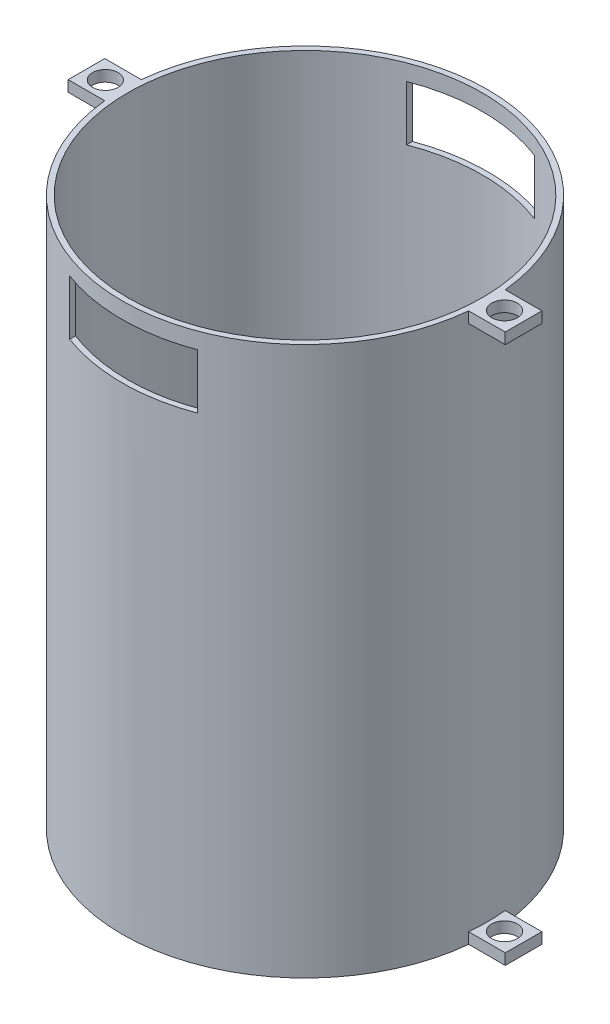
ISO-10303-21;
HEADER;
FILE_DESCRIPTION(('STEP AP214'),'2;1');
FILE_NAME('part.step','',(''),(''),'','','');
FILE_SCHEMA(('AUTOMOTIVE_DESIGN { 1 0 10303 214 1 1 1 1 }'));
ENDSEC;
DATA;
#1=APPLICATION_CONTEXT('core data for automotive mechanical design processes');
#2=APPLICATION_PROTOCOL_DEFINITION('international standard','automotive_design',2000,#1);
#3=PRODUCT_CONTEXT('',#1,'mechanical');
#4=PRODUCT('Part','Part','',(#3));
#5=PRODUCT_RELATED_PRODUCT_CATEGORY('part','',(#4));
#6=PRODUCT_DEFINITION_FORMATION('','',#4);
#7=PRODUCT_DEFINITION_CONTEXT('part definition',#1,'design');
#8=PRODUCT_DEFINITION('design','',#6,#7);
#9=PRODUCT_DEFINITION_SHAPE('','',#8);
#10=(LENGTH_UNIT() NAMED_UNIT(*) SI_UNIT(.MILLI.,.METRE.));
#11=(NAMED_UNIT(*) PLANE_ANGLE_UNIT() SI_UNIT($,.RADIAN.));
#12=(NAMED_UNIT(*) SI_UNIT($,.STERADIAN.) SOLID_ANGLE_UNIT());
#13=UNCERTAINTY_MEASURE_WITH_UNIT(LENGTH_MEASURE(1.E-05),#10,'distance_accuracy_value','');
#14=(GEOMETRIC_REPRESENTATION_CONTEXT(3) GLOBAL_UNCERTAINTY_ASSIGNED_CONTEXT((#13)) GLOBAL_UNIT_ASSIGNED_CONTEXT((#10,
#11,#12)) REPRESENTATION_CONTEXT('',''));
#15=CARTESIAN_POINT('',(0.,0.,0.));
#16=DIRECTION('',(0.,0.,1.));
#17=DIRECTION('',(1.,0.,0.));
#18=AXIS2_PLACEMENT_3D('',#15,#16,#17);
#19=CARTESIAN_POINT('',(0.,150.,0.));
#20=DIRECTION('',(0.,-1.,0.));
#21=DIRECTION('',(0.,0.,-1.));
#22=AXIS2_PLACEMENT_3D('',#19,#20,#21);
#23=CYLINDRICAL_SURFACE('',#22,50.);
#24=DIRECTION('',(0.,-1.,0.));
#25=VECTOR('',#24,1.);
#26=CARTESIAN_POINT('',(17.5,150.,46.837484987988));
#27=LINE('',#26,#25);
#28=CARTESIAN_POINT('',(17.5,130.572258372228,46.837484987988));
#29=VERTEX_POINT('',#28);
#30=CARTESIAN_POINT('',(17.5,145.572258372228,46.837484987988));
#31=VERTEX_POINT('',#30);
#32=EDGE_CURVE('E252',#29,#31,#27,.F.);
#33=ORIENTED_EDGE('',*,*,#32,.F.);
#34=CARTESIAN_POINT('',(0.,130.572258372228,0.));
#35=DIRECTION('',(0.,1.,0.));
#36=DIRECTION('',(0.,0.,1.));
#37=AXIS2_PLACEMENT_3D('',#34,#35,#36);
#38=CIRCLE('',#37,50.);
#39=CARTESIAN_POINT('',(-17.5,130.572258372228,46.837484987988));
#40=VERTEX_POINT('',#39);
#41=EDGE_CURVE('E237',#40,#29,#38,.T.);
#42=ORIENTED_EDGE('',*,*,#41,.F.);
#43=DIRECTION('',(0.,-1.,0.));
#44=VECTOR('',#43,1.);
#45=CARTESIAN_POINT('',(-17.5,150.,46.837484987988));
#46=LINE('',#45,#44);
#47=CARTESIAN_POINT('',(-17.5,145.572258372228,46.837484987988));
#48=VERTEX_POINT('',#47);
#49=EDGE_CURVE('E243',#48,#40,#46,.T.);
#50=ORIENTED_EDGE('',*,*,#49,.F.);
#51=CARTESIAN_POINT('',(0.,145.572258372228,0.));
#52=DIRECTION('',(0.,-1.,0.));
#53=DIRECTION('',(0.,0.,-1.));
#54=AXIS2_PLACEMENT_3D('',#51,#52,#53);
#55=CIRCLE('',#54,50.);
#56=EDGE_CURVE('E251',#31,#48,#55,.T.);
#57=ORIENTED_EDGE('',*,*,#56,.F.);
#58=EDGE_LOOP('',(#33,#42,#50,#57));
#59=FACE_BOUND('',#58,.T.);
#60=DIRECTION('',(0.,1.,0.));
#61=VECTOR('',#60,1.);
#62=CARTESIAN_POINT('',(-49.749371855331,147.,-5.));
#63=LINE('',#62,#61);
#64=CARTESIAN_POINT('',(-49.749371855331,147.,-5.));
#65=VERTEX_POINT('',#64);
#66=CARTESIAN_POINT('',(-49.749371855331,150.,-5.));
#67=VERTEX_POINT('',#66);
#68=EDGE_CURVE('E390',#65,#67,#63,.T.);
#69=ORIENTED_EDGE('',*,*,#68,.T.);
#70=CARTESIAN_POINT('',(0.,150.,0.));
#71=DIRECTION('',(0.,1.,0.));
#72=DIRECTION('',(0.,0.,1.));
#73=AXIS2_PLACEMENT_3D('',#70,#71,#72);
#74=CIRCLE('',#73,50.);
#75=CARTESIAN_POINT('',(49.749371855331,150.,-5.));
#76=VERTEX_POINT('',#75);
#77=EDGE_CURVE('E432',#76,#67,#74,.T.);
#78=ORIENTED_EDGE('',*,*,#77,.F.);
#79=DIRECTION('',(0.,1.,0.));
#80=VECTOR('',#79,1.);
#81=CARTESIAN_POINT('',(49.749371855331,147.,-5.));
#82=LINE('',#81,#80);
#83=CARTESIAN_POINT('',(49.749371855331,147.,-5.));
#84=VERTEX_POINT('',#83);
#85=EDGE_CURVE('E423',#84,#76,#82,.T.);
#86=ORIENTED_EDGE('',*,*,#85,.F.);
#87=CARTESIAN_POINT('',(0.,147.,0.));
#88=DIRECTION('',(0.,1.,0.));
#89=DIRECTION('',(0.,0.,1.));
#90=AXIS2_PLACEMENT_3D('',#87,#88,#89);
#91=CIRCLE('',#90,50.);
#92=CARTESIAN_POINT('',(49.749371855331,147.,5.));
#93=VERTEX_POINT('',#92);
#94=EDGE_CURVE('E436',#93,#84,#91,.T.);
#95=ORIENTED_EDGE('',*,*,#94,.F.);
#96=DIRECTION('',(0.,1.,0.));
#97=VECTOR('',#96,1.);
#98=CARTESIAN_POINT('',(49.749371855331,147.,5.));
#99=LINE('',#98,#97);
#100=CARTESIAN_POINT('',(49.749371855331,150.,5.));
#101=VERTEX_POINT('',#100);
#102=EDGE_CURVE('E427',#93,#101,#99,.T.);
#103=ORIENTED_EDGE('',*,*,#102,.T.);
#104=CARTESIAN_POINT('',(-49.749371855331,150.,5.00000000000003));
#105=VERTEX_POINT('',#104);
#106=EDGE_CURVE('E437',#105,#101,#74,.T.);
#107=ORIENTED_EDGE('',*,*,#106,.F.);
#108=DIRECTION('',(0.,1.,0.));
#109=VECTOR('',#108,1.);
#110=CARTESIAN_POINT('',(-49.749371855331,147.,5.));
#111=LINE('',#110,#109);
#112=CARTESIAN_POINT('',(-49.749371855331,147.,5.));
#113=VERTEX_POINT('',#112);
#114=EDGE_CURVE('E374',#113,#105,#111,.T.);
#115=ORIENTED_EDGE('',*,*,#114,.F.);
#116=CARTESIAN_POINT('',(0.,147.,0.));
#117=DIRECTION('',(0.,-1.,0.));
#118=DIRECTION('',(0.,0.,-1.));
#119=AXIS2_PLACEMENT_3D('',#116,#117,#118);
#120=CIRCLE('',#119,50.);
#121=EDGE_CURVE('E443',#113,#65,#120,.T.);
#122=ORIENTED_EDGE('',*,*,#121,.T.);
#123=EDGE_LOOP('',(#69,#78,#86,#95,#103,#107,#115,#122));
#124=FACE_BOUND('',#123,.T.);
#125=CARTESIAN_POINT('',(0.,3.,0.));
#126=DIRECTION('',(0.,1.,0.));
#127=DIRECTION('',(0.,0.,1.));
#128=AXIS2_PLACEMENT_3D('',#125,#126,#127);
#129=CIRCLE('',#128,50.);
#130=CARTESIAN_POINT('',(49.749371855331,3.,5.));
#131=VERTEX_POINT('',#130);
#132=CARTESIAN_POINT('',(49.749371855331,3.,-5.00000000000003));
#133=VERTEX_POINT('',#132);
#134=EDGE_CURVE('E46',#131,#133,#129,.T.);
#135=ORIENTED_EDGE('',*,*,#134,.T.);
#136=DIRECTION('',(0.,-1.,0.));
#137=VECTOR('',#136,1.);
#138=CARTESIAN_POINT('',(49.749371855331,3.,-5.));
#139=LINE('',#138,#137);
#140=CARTESIAN_POINT('',(49.749371855331,0.,-5.));
#141=VERTEX_POINT('',#140);
#142=EDGE_CURVE('E314',#133,#141,#139,.T.);
#143=ORIENTED_EDGE('',*,*,#142,.T.);
#144=CARTESIAN_POINT('',(0.,0.,0.));
#145=DIRECTION('',(0.,1.,0.));
#146=DIRECTION('',(0.,0.,1.));
#147=AXIS2_PLACEMENT_3D('',#144,#145,#146);
#148=CIRCLE('',#147,50.);
#149=CARTESIAN_POINT('',(-49.749371855331,0.,-5.00000000000003));
#150=VERTEX_POINT('',#149);
#151=EDGE_CURVE('E431',#141,#150,#148,.T.);
#152=ORIENTED_EDGE('',*,*,#151,.T.);
#153=DIRECTION('',(0.,-1.,0.));
#154=VECTOR('',#153,1.);
#155=CARTESIAN_POINT('',(-49.749371855331,3.,-5.));
#156=LINE('',#155,#154);
#157=CARTESIAN_POINT('',(-49.749371855331,3.,-5.00000000000003));
#158=VERTEX_POINT('',#157);
#159=EDGE_CURVE('E337',#158,#150,#156,.T.);
#160=ORIENTED_EDGE('',*,*,#159,.F.);
#161=CARTESIAN_POINT('',(0.,3.,0.));
#162=DIRECTION('',(0.,1.,0.));
#163=DIRECTION('',(0.,0.,1.));
#164=AXIS2_PLACEMENT_3D('',#161,#162,#163);
#165=CIRCLE('',#164,50.);
#166=CARTESIAN_POINT('',(-49.749371855331,3.,5.00000000000003));
#167=VERTEX_POINT('',#166);
#168=EDGE_CURVE('E447',#158,#167,#165,.T.);
#169=ORIENTED_EDGE('',*,*,#168,.T.);
#170=DIRECTION('',(0.,-1.,0.));
#171=VECTOR('',#170,1.);
#172=CARTESIAN_POINT('',(-49.749371855331,3.,5.));
#173=LINE('',#172,#171);
#174=CARTESIAN_POINT('',(-49.749371855331,0.,5.));
#175=VERTEX_POINT('',#174);
#176=EDGE_CURVE('E355',#167,#175,#173,.T.);
#177=ORIENTED_EDGE('',*,*,#176,.T.);
#178=CARTESIAN_POINT('',(49.749371855331,0.,5.));
#179=VERTEX_POINT('',#178);
#180=EDGE_CURVE('E438',#175,#179,#148,.T.);
#181=ORIENTED_EDGE('',*,*,#180,.T.);
#182=DIRECTION('',(0.,-1.,0.));
#183=VECTOR('',#182,1.);
#184=CARTESIAN_POINT('',(49.749371855331,3.,5.));
#185=LINE('',#184,#183);
#186=EDGE_CURVE('E318',#131,#179,#185,.T.);
#187=ORIENTED_EDGE('',*,*,#186,.F.);
#188=EDGE_LOOP('',(#135,#143,#152,#160,#169,#177,#181,#187));
#189=FACE_BOUND('',#188,.T.);
#190=DIRECTION('',(0.,-1.,0.));
#191=VECTOR('',#190,1.);
#192=CARTESIAN_POINT('',(17.5,150.,-46.837484987988));
#193=LINE('',#192,#191);
#194=CARTESIAN_POINT('',(17.5,145.572258372228,-46.837484987988));
#195=VERTEX_POINT('',#194);
#196=CARTESIAN_POINT('',(17.5,130.572258372228,-46.837484987988));
#197=VERTEX_POINT('',#196);
#198=EDGE_CURVE('E255',#195,#197,#193,.T.);
#199=ORIENTED_EDGE('',*,*,#198,.F.);
#200=CARTESIAN_POINT('',(-17.5,145.572258372228,-46.837484987988));
#201=VERTEX_POINT('',#200);
#202=EDGE_CURVE('E247',#201,#195,#55,.T.);
#203=ORIENTED_EDGE('',*,*,#202,.F.);
#204=DIRECTION('',(0.,-1.,0.));
#205=VECTOR('',#204,1.);
#206=CARTESIAN_POINT('',(-17.5,150.,-46.837484987988));
#207=LINE('',#206,#205);
#208=CARTESIAN_POINT('',(-17.5,130.572258372228,-46.837484987988));
#209=VERTEX_POINT('',#208);
#210=EDGE_CURVE('E240',#209,#201,#207,.F.);
#211=ORIENTED_EDGE('',*,*,#210,.F.);
#212=EDGE_CURVE('E216',#197,#209,#38,.T.);
#213=ORIENTED_EDGE('',*,*,#212,.F.);
#214=EDGE_LOOP('',(#199,#203,#211,#213));
#215=FACE_BOUND('',#214,.T.);
#216=ADVANCED_FACE('F38',(#59,#124,#189,#215),#23,.T.);
#217=CARTESIAN_POINT('',(0.,150.,0.));
#218=DIRECTION('',(0.,1.,0.));
#219=DIRECTION('',(0.,0.,1.));
#220=AXIS2_PLACEMENT_3D('',#217,#218,#219);
#221=PLANE('',#220);
#222=CARTESIAN_POINT('',(0.,150.,0.));
#223=DIRECTION('',(0.,1.,0.));
#224=DIRECTION('',(0.,0.,1.));
#225=AXIS2_PLACEMENT_3D('',#222,#223,#224);
#226=CIRCLE('',#225,48.5);
#227=CARTESIAN_POINT('',(0.,150.,48.5));
#228=VERTEX_POINT('',#227);
#229=EDGE_CURVE('E869',#228,#228,#226,.T.);
#230=ORIENTED_EDGE('',*,*,#229,.F.);
#231=EDGE_LOOP('',(#230));
#232=FACE_BOUND('',#231,.T.);
#233=CARTESIAN_POINT('',(-54.5860120609853,150.,0.));
#234=DIRECTION('',(0.,1.,0.));
#235=DIRECTION('',(0.,0.,1.));
#236=AXIS2_PLACEMENT_3D('',#233,#234,#235);
#237=CIRCLE('',#236,3.5);
#238=CARTESIAN_POINT('',(-54.5860120609853,150.,3.5));
#239=VERTEX_POINT('',#238);
#240=EDGE_CURVE('E268',#239,#239,#237,.T.);
#241=ORIENTED_EDGE('',*,*,#240,.F.);
#242=EDGE_LOOP('',(#241));
#243=FACE_BOUND('',#242,.T.);
#244=CARTESIAN_POINT('',(54.5451910506084,150.,0.));
#245=DIRECTION('',(0.,1.,0.));
#246=DIRECTION('',(0.,0.,1.));
#247=AXIS2_PLACEMENT_3D('',#244,#245,#246);
#248=CIRCLE('',#247,3.5);
#249=CARTESIAN_POINT('',(54.5451910506084,150.,3.5));
#250=VERTEX_POINT('',#249);
#251=EDGE_CURVE('E281',#250,#250,#248,.T.);
#252=ORIENTED_EDGE('',*,*,#251,.F.);
#253=EDGE_LOOP('',(#252));
#254=FACE_BOUND('',#253,.T.);
#255=ORIENTED_EDGE('',*,*,#77,.T.);
#256=DIRECTION('',(1.,0.,0.));
#257=VECTOR('',#256,1.);
#258=CARTESIAN_POINT('',(-59.749371855331,150.,-5.));
#259=LINE('',#258,#257);
#260=CARTESIAN_POINT('',(-59.749371855331,150.,-5.));
#261=VERTEX_POINT('',#260);
#262=EDGE_CURVE('E377',#261,#67,#259,.T.);
#263=ORIENTED_EDGE('',*,*,#262,.F.);
#264=DIRECTION('',(0.,0.,1.));
#265=VECTOR('',#264,1.);
#266=CARTESIAN_POINT('',(-59.749371855331,150.,-5.));
#267=LINE('',#266,#265);
#268=CARTESIAN_POINT('',(-59.749371855331,150.,5.));
#269=VERTEX_POINT('',#268);
#270=EDGE_CURVE('E367',#261,#269,#267,.T.);
#271=ORIENTED_EDGE('',*,*,#270,.T.);
#272=DIRECTION('',(1.,0.,0.));
#273=VECTOR('',#272,1.);
#274=CARTESIAN_POINT('',(-59.749371855331,150.,5.));
#275=LINE('',#274,#273);
#276=EDGE_CURVE('E351',#269,#105,#275,.T.);
#277=ORIENTED_EDGE('',*,*,#276,.T.);
#278=ORIENTED_EDGE('',*,*,#106,.T.);
#279=DIRECTION('',(-1.,0.,0.));
#280=VECTOR('',#279,1.);
#281=CARTESIAN_POINT('',(59.749371855331,150.,5.));
#282=LINE('',#281,#280);
#283=CARTESIAN_POINT('',(59.749371855331,150.,5.));
#284=VERTEX_POINT('',#283);
#285=EDGE_CURVE('E386',#284,#101,#282,.T.);
#286=ORIENTED_EDGE('',*,*,#285,.F.);
#287=DIRECTION('',(0.,0.,1.));
#288=VECTOR('',#287,1.);
#289=CARTESIAN_POINT('',(59.749371855331,150.,-5.));
#290=LINE('',#289,#288);
#291=CARTESIAN_POINT('',(59.749371855331,150.,-5.));
#292=VERTEX_POINT('',#291);
#293=EDGE_CURVE('E401',#292,#284,#290,.T.);
#294=ORIENTED_EDGE('',*,*,#293,.F.);
#295=DIRECTION('',(-1.,0.,0.));
#296=VECTOR('',#295,1.);
#297=CARTESIAN_POINT('',(59.749371855331,150.,-5.));
#298=LINE('',#297,#296);
#299=EDGE_CURVE('E412',#292,#76,#298,.T.);
#300=ORIENTED_EDGE('',*,*,#299,.T.);
#301=EDGE_LOOP('',(#255,#263,#271,#277,#278,#286,#294,#300));
#302=FACE_BOUND('',#301,.T.);
#303=ADVANCED_FACE('F509',(#232,#243,#254,#302),#221,.T.);
#304=CARTESIAN_POINT('',(0.,0.,0.));
#305=DIRECTION('',(0.,1.,0.));
#306=DIRECTION('',(0.,0.,1.));
#307=AXIS2_PLACEMENT_3D('',#304,#305,#306);
#308=PLANE('',#307);
#309=CARTESIAN_POINT('',(0.,0.,0.));
#310=DIRECTION('',(0.,1.,0.));
#311=DIRECTION('',(0.,0.,1.));
#312=AXIS2_PLACEMENT_3D('',#309,#310,#311);
#313=CIRCLE('',#312,48.5);
#314=CARTESIAN_POINT('',(0.,0.,48.5));
#315=VERTEX_POINT('',#314);
#316=EDGE_CURVE('E212',#315,#315,#313,.T.);
#317=ORIENTED_EDGE('',*,*,#316,.T.);
#318=EDGE_LOOP('',(#317));
#319=FACE_BOUND('',#318,.T.);
#320=CARTESIAN_POINT('',(-54.5860120609853,0.,0.));
#321=DIRECTION('',(0.,-1.,0.));
#322=DIRECTION('',(0.,0.,-1.));
#323=AXIS2_PLACEMENT_3D('',#320,#321,#322);
#324=CIRCLE('',#323,3.5);
#325=CARTESIAN_POINT('',(-54.5860120609853,0.,-3.5));
#326=VERTEX_POINT('',#325);
#327=EDGE_CURVE('E259',#326,#326,#324,.T.);
#328=ORIENTED_EDGE('',*,*,#327,.F.);
#329=EDGE_LOOP('',(#328));
#330=FACE_BOUND('',#329,.T.);
#331=CARTESIAN_POINT('',(54.5451910506084,0.,0.));
#332=DIRECTION('',(0.,-1.,0.));
#333=DIRECTION('',(0.,0.,-1.));
#334=AXIS2_PLACEMENT_3D('',#331,#332,#333);
#335=CIRCLE('',#334,3.5);
#336=CARTESIAN_POINT('',(54.5451910506084,0.,-3.5));
#337=VERTEX_POINT('',#336);
#338=EDGE_CURVE('E272',#337,#337,#335,.T.);
#339=ORIENTED_EDGE('',*,*,#338,.F.);
#340=EDGE_LOOP('',(#339));
#341=FACE_BOUND('',#340,.T.);
#342=ORIENTED_EDGE('',*,*,#151,.F.);
#343=DIRECTION('',(1.,0.,0.));
#344=VECTOR('',#343,1.);
#345=CARTESIAN_POINT('',(59.749371855331,0.,-5.));
#346=LINE('',#345,#344);
#347=CARTESIAN_POINT('',(59.749371855331,0.,-5.));
#348=VERTEX_POINT('',#347);
#349=EDGE_CURVE('E291',#141,#348,#346,.T.);
#350=ORIENTED_EDGE('',*,*,#349,.T.);
#351=DIRECTION('',(0.,0.,1.));
#352=VECTOR('',#351,1.);
#353=CARTESIAN_POINT('',(59.749371855331,0.,5.));
#354=LINE('',#353,#352);
#355=CARTESIAN_POINT('',(59.749371855331,0.,5.));
#356=VERTEX_POINT('',#355);
#357=EDGE_CURVE('E285',#348,#356,#354,.T.);
#358=ORIENTED_EDGE('',*,*,#357,.T.);
#359=DIRECTION('',(-1.,0.,0.));
#360=VECTOR('',#359,1.);
#361=CARTESIAN_POINT('',(59.749371855331,0.,5.));
#362=LINE('',#361,#360);
#363=EDGE_CURVE('E303',#356,#179,#362,.T.);
#364=ORIENTED_EDGE('',*,*,#363,.T.);
#365=ORIENTED_EDGE('',*,*,#180,.F.);
#366=DIRECTION('',(1.,0.,0.));
#367=VECTOR('',#366,1.);
#368=CARTESIAN_POINT('',(-59.749371855331,0.,5.));
#369=LINE('',#368,#367);
#370=CARTESIAN_POINT('',(-59.749371855331,0.,5.));
#371=VERTEX_POINT('',#370);
#372=EDGE_CURVE('E341',#371,#175,#369,.T.);
#373=ORIENTED_EDGE('',*,*,#372,.F.);
#374=DIRECTION('',(0.,0.,-1.));
#375=VECTOR('',#374,1.);
#376=CARTESIAN_POINT('',(-59.749371855331,0.,5.));
#377=LINE('',#376,#375);
#378=CARTESIAN_POINT('',(-59.749371855331,0.,-5.));
#379=VERTEX_POINT('',#378);
#380=EDGE_CURVE('E329',#371,#379,#377,.T.);
#381=ORIENTED_EDGE('',*,*,#380,.T.);
#382=DIRECTION('',(1.,0.,0.));
#383=VECTOR('',#382,1.);
#384=CARTESIAN_POINT('',(-59.749371855331,0.,-5.));
#385=LINE('',#384,#383);
#386=EDGE_CURVE('E313',#379,#150,#385,.T.);
#387=ORIENTED_EDGE('',*,*,#386,.T.);
#388=EDGE_LOOP('',(#342,#350,#358,#364,#365,#373,#381,#387));
#389=FACE_BOUND('',#388,.T.);
#390=ADVANCED_FACE('F488',(#319,#330,#341,#389),#308,.F.);
#391=CARTESIAN_POINT('',(59.749371855331,147.,5.));
#392=DIRECTION('',(0.,0.,-1.));
#393=DIRECTION('',(-1.,0.,0.));
#394=AXIS2_PLACEMENT_3D('',#391,#392,#393);
#395=PLANE('',#394);
#396=ORIENTED_EDGE('',*,*,#285,.T.);
#397=ORIENTED_EDGE('',*,*,#102,.F.);
#398=DIRECTION('',(-1.,0.,0.));
#399=VECTOR('',#398,1.);
#400=CARTESIAN_POINT('',(59.749371855331,147.,5.));
#401=LINE('',#400,#399);
#402=CARTESIAN_POINT('',(59.749371855331,147.,5.));
#403=VERTEX_POINT('',#402);
#404=EDGE_CURVE('E397',#403,#93,#401,.T.);
#405=ORIENTED_EDGE('',*,*,#404,.F.);
#406=DIRECTION('',(0.,1.,0.));
#407=VECTOR('',#406,1.);
#408=CARTESIAN_POINT('',(59.749371855331,147.,5.));
#409=LINE('',#408,#407);
#410=EDGE_CURVE('E408',#403,#284,#409,.T.);
#411=ORIENTED_EDGE('',*,*,#410,.T.);
#412=EDGE_LOOP('',(#396,#397,#405,#411));
#413=FACE_BOUND('',#412,.T.);
#414=ADVANCED_FACE('F545',(#413),#395,.F.);
#415=CARTESIAN_POINT('',(59.749371855331,147.,-5.));
#416=DIRECTION('',(0.,0.,-1.));
#417=DIRECTION('',(-1.,0.,0.));
#418=AXIS2_PLACEMENT_3D('',#415,#416,#417);
#419=PLANE('',#418);
#420=ORIENTED_EDGE('',*,*,#299,.F.);
#421=DIRECTION('',(0.,1.,0.));
#422=VECTOR('',#421,1.);
#423=CARTESIAN_POINT('',(59.749371855331,147.,-5.));
#424=LINE('',#423,#422);
#425=CARTESIAN_POINT('',(59.749371855331,147.,-5.));
#426=VERTEX_POINT('',#425);
#427=EDGE_CURVE('E420',#426,#292,#424,.T.);
#428=ORIENTED_EDGE('',*,*,#427,.F.);
#429=DIRECTION('',(-1.,0.,0.));
#430=VECTOR('',#429,1.);
#431=CARTESIAN_POINT('',(59.749371855331,147.,-5.));
#432=LINE('',#431,#430);
#433=EDGE_CURVE('E400',#426,#84,#432,.T.);
#434=ORIENTED_EDGE('',*,*,#433,.T.);
#435=ORIENTED_EDGE('',*,*,#85,.T.);
#436=EDGE_LOOP('',(#420,#428,#434,#435));
#437=FACE_BOUND('',#436,.T.);
#438=ADVANCED_FACE('F534',(#437),#419,.T.);
#439=CARTESIAN_POINT('',(59.749371855331,147.,-5.));
#440=DIRECTION('',(-1.,0.,0.));
#441=DIRECTION('',(0.,0.,1.));
#442=AXIS2_PLACEMENT_3D('',#439,#440,#441);
#443=PLANE('',#442);
#444=ORIENTED_EDGE('',*,*,#293,.T.);
#445=ORIENTED_EDGE('',*,*,#410,.F.);
#446=DIRECTION('',(0.,0.,1.));
#447=VECTOR('',#446,1.);
#448=CARTESIAN_POINT('',(59.749371855331,147.,-5.));
#449=LINE('',#448,#447);
#450=EDGE_CURVE('E405',#426,#403,#449,.T.);
#451=ORIENTED_EDGE('',*,*,#450,.F.);
#452=ORIENTED_EDGE('',*,*,#427,.T.);
#453=EDGE_LOOP('',(#444,#445,#451,#452));
#454=FACE_BOUND('',#453,.T.);
#455=ADVANCED_FACE('F572',(#454),#443,.F.);
#456=CARTESIAN_POINT('',(0.,147.,0.));
#457=DIRECTION('',(0.,1.,0.));
#458=DIRECTION('',(0.,0.,1.));
#459=AXIS2_PLACEMENT_3D('',#456,#457,#458);
#460=PLANE('',#459);
#461=CARTESIAN_POINT('',(54.5451910506084,147.,0.));
#462=DIRECTION('',(0.,1.,0.));
#463=DIRECTION('',(0.,0.,1.));
#464=AXIS2_PLACEMENT_3D('',#461,#462,#463);
#465=CIRCLE('',#464,3.5);
#466=CARTESIAN_POINT('',(54.5451910506084,147.,3.5));
#467=VERTEX_POINT('',#466);
#468=EDGE_CURVE('E277',#467,#467,#465,.T.);
#469=ORIENTED_EDGE('',*,*,#468,.T.);
#470=EDGE_LOOP('',(#469));
#471=FACE_BOUND('',#470,.T.);
#472=ORIENTED_EDGE('',*,*,#404,.T.);
#473=ORIENTED_EDGE('',*,*,#94,.T.);
#474=ORIENTED_EDGE('',*,*,#433,.F.);
#475=ORIENTED_EDGE('',*,*,#450,.T.);
#476=EDGE_LOOP('',(#472,#473,#474,#475));
#477=FACE_BOUND('',#476,.T.);
#478=ADVANCED_FACE('F540',(#471,#477),#460,.F.);
#479=CARTESIAN_POINT('',(-59.749371855331,147.,5.));
#480=DIRECTION('',(0.,0.,1.));
#481=DIRECTION('',(1.,0.,0.));
#482=AXIS2_PLACEMENT_3D('',#479,#480,#481);
#483=PLANE('',#482);
#484=ORIENTED_EDGE('',*,*,#276,.F.);
#485=DIRECTION('',(0.,1.,0.));
#486=VECTOR('',#485,1.);
#487=CARTESIAN_POINT('',(-59.749371855331,147.,5.));
#488=LINE('',#487,#486);
#489=CARTESIAN_POINT('',(-59.749371855331,147.,5.));
#490=VERTEX_POINT('',#489);
#491=EDGE_CURVE('E383',#490,#269,#488,.T.);
#492=ORIENTED_EDGE('',*,*,#491,.F.);
#493=DIRECTION('',(1.,0.,0.));
#494=VECTOR('',#493,1.);
#495=CARTESIAN_POINT('',(-59.749371855331,147.,5.));
#496=LINE('',#495,#494);
#497=EDGE_CURVE('E362',#490,#113,#496,.T.);
#498=ORIENTED_EDGE('',*,*,#497,.T.);
#499=ORIENTED_EDGE('',*,*,#114,.T.);
#500=EDGE_LOOP('',(#484,#492,#498,#499));
#501=FACE_BOUND('',#500,.T.);
#502=ADVANCED_FACE('F550',(#501),#483,.T.);
#503=CARTESIAN_POINT('',(-59.749371855331,147.,-5.));
#504=DIRECTION('',(-1.,0.,0.));
#505=DIRECTION('',(0.,0.,1.));
#506=AXIS2_PLACEMENT_3D('',#503,#504,#505);
#507=PLANE('',#506);
#508=ORIENTED_EDGE('',*,*,#270,.F.);
#509=DIRECTION('',(0.,1.,0.));
#510=VECTOR('',#509,1.);
#511=CARTESIAN_POINT('',(-59.749371855331,147.,-5.));
#512=LINE('',#511,#510);
#513=CARTESIAN_POINT('',(-59.749371855331,147.,-5.));
#514=VERTEX_POINT('',#513);
#515=EDGE_CURVE('E387',#514,#261,#512,.T.);
#516=ORIENTED_EDGE('',*,*,#515,.F.);
#517=DIRECTION('',(0.,0.,1.));
#518=VECTOR('',#517,1.);
#519=CARTESIAN_POINT('',(-59.749371855331,147.,-5.));
#520=LINE('',#519,#518);
#521=EDGE_CURVE('E370',#514,#490,#520,.T.);
#522=ORIENTED_EDGE('',*,*,#521,.T.);
#523=ORIENTED_EDGE('',*,*,#491,.T.);
#524=EDGE_LOOP('',(#508,#516,#522,#523));
#525=FACE_BOUND('',#524,.T.);
#526=ADVANCED_FACE('F556',(#525),#507,.T.);
#527=CARTESIAN_POINT('',(-59.749371855331,147.,-5.));
#528=DIRECTION('',(0.,0.,1.));
#529=DIRECTION('',(1.,0.,0.));
#530=AXIS2_PLACEMENT_3D('',#527,#528,#529);
#531=PLANE('',#530);
#532=ORIENTED_EDGE('',*,*,#262,.T.);
#533=ORIENTED_EDGE('',*,*,#68,.F.);
#534=DIRECTION('',(1.,0.,0.));
#535=VECTOR('',#534,1.);
#536=CARTESIAN_POINT('',(-59.749371855331,147.,-5.));
#537=LINE('',#536,#535);
#538=EDGE_CURVE('E366',#514,#65,#537,.T.);
#539=ORIENTED_EDGE('',*,*,#538,.F.);
#540=ORIENTED_EDGE('',*,*,#515,.T.);
#541=EDGE_LOOP('',(#532,#533,#539,#540));
#542=FACE_BOUND('',#541,.T.);
#543=ADVANCED_FACE('F557',(#542),#531,.F.);
#544=CARTESIAN_POINT('',(0.,147.,0.));
#545=DIRECTION('',(0.,-1.,0.));
#546=DIRECTION('',(0.,0.,-1.));
#547=AXIS2_PLACEMENT_3D('',#544,#545,#546);
#548=PLANE('',#547);
#549=CARTESIAN_POINT('',(-54.5860120609853,147.,0.));
#550=DIRECTION('',(0.,-1.,0.));
#551=DIRECTION('',(0.,0.,-1.));
#552=AXIS2_PLACEMENT_3D('',#549,#550,#551);
#553=CIRCLE('',#552,3.5);
#554=CARTESIAN_POINT('',(-54.5860120609853,147.,-3.5));
#555=VERTEX_POINT('',#554);
#556=EDGE_CURVE('E264',#555,#555,#553,.T.);
#557=ORIENTED_EDGE('',*,*,#556,.F.);
#558=EDGE_LOOP('',(#557));
#559=FACE_BOUND('',#558,.T.);
#560=ORIENTED_EDGE('',*,*,#121,.F.);
#561=ORIENTED_EDGE('',*,*,#497,.F.);
#562=ORIENTED_EDGE('',*,*,#521,.F.);
#563=ORIENTED_EDGE('',*,*,#538,.T.);
#564=EDGE_LOOP('',(#560,#561,#562,#563));
#565=FACE_BOUND('',#564,.T.);
#566=ADVANCED_FACE('F554',(#559,#565),#548,.T.);
#567=CARTESIAN_POINT('',(-59.749371855331,3.,-5.));
#568=DIRECTION('',(0.,0.,-1.));
#569=DIRECTION('',(-1.,0.,0.));
#570=AXIS2_PLACEMENT_3D('',#567,#568,#569);
#571=PLANE('',#570);
#572=ORIENTED_EDGE('',*,*,#386,.F.);
#573=DIRECTION('',(0.,-1.,0.));
#574=VECTOR('',#573,1.);
#575=CARTESIAN_POINT('',(-59.749371855331,3.,-5.));
#576=LINE('',#575,#574);
#577=CARTESIAN_POINT('',(-59.749371855331,3.,-5.));
#578=VERTEX_POINT('',#577);
#579=EDGE_CURVE('E348',#578,#379,#576,.T.);
#580=ORIENTED_EDGE('',*,*,#579,.F.);
#581=DIRECTION('',(1.,0.,0.));
#582=VECTOR('',#581,1.);
#583=CARTESIAN_POINT('',(-59.749371855331,3.,-5.));
#584=LINE('',#583,#582);
#585=EDGE_CURVE('E324',#578,#158,#584,.T.);
#586=ORIENTED_EDGE('',*,*,#585,.T.);
#587=ORIENTED_EDGE('',*,*,#159,.T.);
#588=EDGE_LOOP('',(#572,#580,#586,#587));
#589=FACE_BOUND('',#588,.T.);
#590=ADVANCED_FACE('F475',(#589),#571,.T.);
#591=CARTESIAN_POINT('',(-59.749371855331,3.,5.));
#592=DIRECTION('',(-1.,0.,0.));
#593=DIRECTION('',(0.,0.,1.));
#594=AXIS2_PLACEMENT_3D('',#591,#592,#593);
#595=PLANE('',#594);
#596=ORIENTED_EDGE('',*,*,#380,.F.);
#597=DIRECTION('',(0.,-1.,0.));
#598=VECTOR('',#597,1.);
#599=CARTESIAN_POINT('',(-59.749371855331,3.,5.));
#600=LINE('',#599,#598);
#601=CARTESIAN_POINT('',(-59.749371855331,3.,5.));
#602=VERTEX_POINT('',#601);
#603=EDGE_CURVE('E352',#602,#371,#600,.T.);
#604=ORIENTED_EDGE('',*,*,#603,.F.);
#605=DIRECTION('',(0.,0.,-1.));
#606=VECTOR('',#605,1.);
#607=CARTESIAN_POINT('',(-59.749371855331,3.,5.));
#608=LINE('',#607,#606);
#609=EDGE_CURVE('E333',#602,#578,#608,.T.);
#610=ORIENTED_EDGE('',*,*,#609,.T.);
#611=ORIENTED_EDGE('',*,*,#579,.T.);
#612=EDGE_LOOP('',(#596,#604,#610,#611));
#613=FACE_BOUND('',#612,.T.);
#614=ADVANCED_FACE('F478',(#613),#595,.T.);
#615=CARTESIAN_POINT('',(-59.749371855331,3.,5.));
#616=DIRECTION('',(0.,0.,-1.));
#617=DIRECTION('',(-1.,0.,0.));
#618=AXIS2_PLACEMENT_3D('',#615,#616,#617);
#619=PLANE('',#618);
#620=ORIENTED_EDGE('',*,*,#372,.T.);
#621=ORIENTED_EDGE('',*,*,#176,.F.);
#622=DIRECTION('',(1.,0.,0.));
#623=VECTOR('',#622,1.);
#624=CARTESIAN_POINT('',(-59.749371855331,3.,5.));
#625=LINE('',#624,#623);
#626=EDGE_CURVE('E328',#602,#167,#625,.T.);
#627=ORIENTED_EDGE('',*,*,#626,.F.);
#628=ORIENTED_EDGE('',*,*,#603,.T.);
#629=EDGE_LOOP('',(#620,#621,#627,#628));
#630=FACE_BOUND('',#629,.T.);
#631=ADVANCED_FACE('F465',(#630),#619,.F.);
#632=CARTESIAN_POINT('',(0.,3.,0.));
#633=DIRECTION('',(0.,1.,0.));
#634=DIRECTION('',(0.,0.,1.));
#635=AXIS2_PLACEMENT_3D('',#632,#633,#634);
#636=PLANE('',#635);
#637=CARTESIAN_POINT('',(-54.5860120609853,3.,0.));
#638=DIRECTION('',(0.,1.,0.));
#639=DIRECTION('',(0.,0.,1.));
#640=AXIS2_PLACEMENT_3D('',#637,#638,#639);
#641=CIRCLE('',#640,3.5);
#642=CARTESIAN_POINT('',(-54.5860120609853,3.,3.5));
#643=VERTEX_POINT('',#642);
#644=EDGE_CURVE('E263',#643,#643,#641,.T.);
#645=ORIENTED_EDGE('',*,*,#644,.F.);
#646=EDGE_LOOP('',(#645));
#647=FACE_BOUND('',#646,.T.);
#648=ORIENTED_EDGE('',*,*,#168,.F.);
#649=ORIENTED_EDGE('',*,*,#585,.F.);
#650=ORIENTED_EDGE('',*,*,#609,.F.);
#651=ORIENTED_EDGE('',*,*,#626,.T.);
#652=EDGE_LOOP('',(#648,#649,#650,#651));
#653=FACE_BOUND('',#652,.T.);
#654=ADVANCED_FACE('F461',(#647,#653),#636,.T.);
#655=CARTESIAN_POINT('',(59.749371855331,3.,5.));
#656=DIRECTION('',(1.,0.,0.));
#657=DIRECTION('',(0.,0.,-1.));
#658=AXIS2_PLACEMENT_3D('',#655,#656,#657);
#659=PLANE('',#658);
#660=ORIENTED_EDGE('',*,*,#357,.F.);
#661=DIRECTION('',(0.,-1.,0.));
#662=VECTOR('',#661,1.);
#663=CARTESIAN_POINT('',(59.749371855331,3.,-5.));
#664=LINE('',#663,#662);
#665=CARTESIAN_POINT('',(59.749371855331,3.,-5.));
#666=VERTEX_POINT('',#665);
#667=EDGE_CURVE('E310',#666,#348,#664,.T.);
#668=ORIENTED_EDGE('',*,*,#667,.F.);
#669=DIRECTION('',(0.,0.,1.));
#670=VECTOR('',#669,1.);
#671=CARTESIAN_POINT('',(59.749371855331,3.,5.));
#672=LINE('',#671,#670);
#673=CARTESIAN_POINT('',(59.749371855331,3.,5.));
#674=VERTEX_POINT('',#673);
#675=EDGE_CURVE('E286',#666,#674,#672,.T.);
#676=ORIENTED_EDGE('',*,*,#675,.T.);
#677=DIRECTION('',(0.,-1.,0.));
#678=VECTOR('',#677,1.);
#679=CARTESIAN_POINT('',(59.749371855331,3.,5.));
#680=LINE('',#679,#678);
#681=EDGE_CURVE('E299',#674,#356,#680,.T.);
#682=ORIENTED_EDGE('',*,*,#681,.T.);
#683=EDGE_LOOP('',(#660,#668,#676,#682));
#684=FACE_BOUND('',#683,.T.);
#685=ADVANCED_FACE('F464',(#684),#659,.T.);
#686=CARTESIAN_POINT('',(59.749371855331,3.,-5.));
#687=DIRECTION('',(0.,0.,-1.));
#688=DIRECTION('',(-1.,0.,0.));
#689=AXIS2_PLACEMENT_3D('',#686,#687,#688);
#690=PLANE('',#689);
#691=ORIENTED_EDGE('',*,*,#349,.F.);
#692=ORIENTED_EDGE('',*,*,#142,.F.);
#693=DIRECTION('',(1.,0.,0.));
#694=VECTOR('',#693,1.);
#695=CARTESIAN_POINT('',(59.749371855331,3.,-5.));
#696=LINE('',#695,#694);
#697=EDGE_CURVE('E295',#133,#666,#696,.T.);
#698=ORIENTED_EDGE('',*,*,#697,.T.);
#699=ORIENTED_EDGE('',*,*,#667,.T.);
#700=EDGE_LOOP('',(#691,#692,#698,#699));
#701=FACE_BOUND('',#700,.T.);
#702=ADVANCED_FACE('F498',(#701),#690,.T.);
#703=CARTESIAN_POINT('',(59.749371855331,3.,5.));
#704=DIRECTION('',(0.,0.,1.));
#705=DIRECTION('',(1.,0.,0.));
#706=AXIS2_PLACEMENT_3D('',#703,#704,#705);
#707=PLANE('',#706);
#708=ORIENTED_EDGE('',*,*,#363,.F.);
#709=ORIENTED_EDGE('',*,*,#681,.F.);
#710=DIRECTION('',(-1.,0.,0.));
#711=VECTOR('',#710,1.);
#712=CARTESIAN_POINT('',(59.749371855331,3.,5.));
#713=LINE('',#712,#711);
#714=EDGE_CURVE('E290',#674,#131,#713,.T.);
#715=ORIENTED_EDGE('',*,*,#714,.T.);
#716=ORIENTED_EDGE('',*,*,#186,.T.);
#717=EDGE_LOOP('',(#708,#709,#715,#716));
#718=FACE_BOUND('',#717,.T.);
#719=ADVANCED_FACE('F486',(#718),#707,.T.);
#720=CARTESIAN_POINT('',(0.,3.,0.));
#721=DIRECTION('',(0.,1.,0.));
#722=DIRECTION('',(0.,0.,1.));
#723=AXIS2_PLACEMENT_3D('',#720,#721,#722);
#724=PLANE('',#723);
#725=CARTESIAN_POINT('',(54.5451910506084,3.,0.));
#726=DIRECTION('',(0.,1.,0.));
#727=DIRECTION('',(0.,0.,1.));
#728=AXIS2_PLACEMENT_3D('',#725,#726,#727);
#729=CIRCLE('',#728,3.5);
#730=CARTESIAN_POINT('',(54.5451910506084,3.,3.5));
#731=VERTEX_POINT('',#730);
#732=EDGE_CURVE('E276',#731,#731,#729,.T.);
#733=ORIENTED_EDGE('',*,*,#732,.F.);
#734=EDGE_LOOP('',(#733));
#735=FACE_BOUND('',#734,.T.);
#736=ORIENTED_EDGE('',*,*,#134,.F.);
#737=ORIENTED_EDGE('',*,*,#714,.F.);
#738=ORIENTED_EDGE('',*,*,#675,.F.);
#739=ORIENTED_EDGE('',*,*,#697,.F.);
#740=EDGE_LOOP('',(#736,#737,#738,#739));
#741=FACE_BOUND('',#740,.T.);
#742=ADVANCED_FACE('F494',(#735,#741),#724,.T.);
#743=CARTESIAN_POINT('',(54.5451910506084,200.,0.));
#744=DIRECTION('',(0.,-1.,0.));
#745=DIRECTION('',(0.,0.,-1.));
#746=AXIS2_PLACEMENT_3D('',#743,#744,#745);
#747=CYLINDRICAL_SURFACE('',#746,3.5);
#748=ORIENTED_EDGE('',*,*,#732,.T.);
#749=EDGE_LOOP('',(#748));
#750=FACE_BOUND('',#749,.T.);
#751=ORIENTED_EDGE('',*,*,#338,.T.);
#752=EDGE_LOOP('',(#751));
#753=FACE_BOUND('',#752,.T.);
#754=ADVANCED_FACE('F592',(#750,#753),#747,.F.);
#755=ORIENTED_EDGE('',*,*,#251,.T.);
#756=EDGE_LOOP('',(#755));
#757=FACE_BOUND('',#756,.T.);
#758=ORIENTED_EDGE('',*,*,#468,.F.);
#759=EDGE_LOOP('',(#758));
#760=FACE_BOUND('',#759,.T.);
#761=ADVANCED_FACE('F594',(#757,#760),#747,.F.);
#762=CARTESIAN_POINT('',(-54.5860120609853,200.,0.));
#763=DIRECTION('',(0.,-1.,0.));
#764=DIRECTION('',(0.,0.,-1.));
#765=AXIS2_PLACEMENT_3D('',#762,#763,#764);
#766=CYLINDRICAL_SURFACE('',#765,3.5);
#767=ORIENTED_EDGE('',*,*,#644,.T.);
#768=EDGE_LOOP('',(#767));
#769=FACE_BOUND('',#768,.T.);
#770=ORIENTED_EDGE('',*,*,#327,.T.);
#771=EDGE_LOOP('',(#770));
#772=FACE_BOUND('',#771,.T.);
#773=ADVANCED_FACE('F458',(#769,#772),#766,.F.);
#774=ORIENTED_EDGE('',*,*,#240,.T.);
#775=EDGE_LOOP('',(#774));
#776=FACE_BOUND('',#775,.T.);
#777=ORIENTED_EDGE('',*,*,#556,.T.);
#778=EDGE_LOOP('',(#777));
#779=FACE_BOUND('',#778,.T.);
#780=ADVANCED_FACE('F606',(#776,#779),#766,.F.);
#781=CARTESIAN_POINT('',(-17.5,130.572258372228,150.));
#782=DIRECTION('',(0.,1.,0.));
#783=DIRECTION('',(0.,0.,1.));
#784=AXIS2_PLACEMENT_3D('',#781,#782,#783);
#785=PLANE('',#784);
#786=CARTESIAN_POINT('',(0.,130.572258372228,0.));
#787=DIRECTION('',(0.,1.,0.));
#788=DIRECTION('',(0.,0.,1.));
#789=AXIS2_PLACEMENT_3D('',#786,#787,#788);
#790=CIRCLE('',#789,48.5);
#791=CARTESIAN_POINT('',(-17.5,130.572258372228,45.2327315115946));
#792=VERTEX_POINT('',#791);
#793=CARTESIAN_POINT('',(17.5,130.572258372228,45.2327315115946));
#794=VERTEX_POINT('',#793);
#795=EDGE_CURVE('E53',#792,#794,#790,.T.);
#796=ORIENTED_EDGE('',*,*,#795,.F.);
#797=DIRECTION('',(0.,0.,-1.));
#798=VECTOR('',#797,1.);
#799=CARTESIAN_POINT('',(-17.5,130.572258372228,150.));
#800=LINE('',#799,#798);
#801=EDGE_CURVE('E219',#40,#792,#800,.T.);
#802=ORIENTED_EDGE('',*,*,#801,.F.);
#803=ORIENTED_EDGE('',*,*,#41,.T.);
#804=DIRECTION('',(0.,0.,-1.));
#805=VECTOR('',#804,1.);
#806=CARTESIAN_POINT('',(17.5,130.572258372228,150.));
#807=LINE('',#806,#805);
#808=EDGE_CURVE('E220',#29,#794,#807,.T.);
#809=ORIENTED_EDGE('',*,*,#808,.T.);
#810=EDGE_LOOP('',(#796,#802,#803,#809));
#811=FACE_BOUND('',#810,.T.);
#812=ADVANCED_FACE('F620',(#811),#785,.T.);
#813=CARTESIAN_POINT('',(-17.5,145.572258372228,150.));
#814=DIRECTION('',(1.,0.,0.));
#815=DIRECTION('',(0.,0.,-1.));
#816=AXIS2_PLACEMENT_3D('',#813,#814,#815);
#817=PLANE('',#816);
#818=DIRECTION('',(0.,1.,0.));
#819=VECTOR('',#818,1.);
#820=CARTESIAN_POINT('',(-17.5,0.,45.2327315115946));
#821=LINE('',#820,#819);
#822=CARTESIAN_POINT('',(-17.5,145.572258372228,45.2327315115946));
#823=VERTEX_POINT('',#822);
#824=EDGE_CURVE('E840',#823,#792,#821,.F.);
#825=ORIENTED_EDGE('',*,*,#824,.F.);
#826=DIRECTION('',(0.,0.,-1.));
#827=VECTOR('',#826,1.);
#828=CARTESIAN_POINT('',(-17.5,145.572258372228,150.));
#829=LINE('',#828,#827);
#830=EDGE_CURVE('E232',#48,#823,#829,.T.);
#831=ORIENTED_EDGE('',*,*,#830,.F.);
#832=ORIENTED_EDGE('',*,*,#49,.T.);
#833=ORIENTED_EDGE('',*,*,#801,.T.);
#834=EDGE_LOOP('',(#825,#831,#832,#833));
#835=FACE_BOUND('',#834,.T.);
#836=ADVANCED_FACE('F616',(#835),#817,.T.);
#837=CARTESIAN_POINT('',(-17.5,145.572258372228,150.));
#838=DIRECTION('',(0.,-1.,0.));
#839=DIRECTION('',(0.,0.,-1.));
#840=AXIS2_PLACEMENT_3D('',#837,#838,#839);
#841=PLANE('',#840);
#842=CARTESIAN_POINT('',(0.,145.572258372228,0.));
#843=DIRECTION('',(0.,-1.,0.));
#844=DIRECTION('',(0.,0.,-1.));
#845=AXIS2_PLACEMENT_3D('',#842,#843,#844);
#846=CIRCLE('',#845,48.5);
#847=CARTESIAN_POINT('',(17.5,145.572258372228,45.2327315115946));
#848=VERTEX_POINT('',#847);
#849=EDGE_CURVE('E850',#848,#823,#846,.T.);
#850=ORIENTED_EDGE('',*,*,#849,.F.);
#851=DIRECTION('',(0.,0.,-1.));
#852=VECTOR('',#851,1.);
#853=CARTESIAN_POINT('',(17.5,145.572258372228,150.));
#854=LINE('',#853,#852);
#855=EDGE_CURVE('E236',#31,#848,#854,.T.);
#856=ORIENTED_EDGE('',*,*,#855,.F.);
#857=ORIENTED_EDGE('',*,*,#56,.T.);
#858=ORIENTED_EDGE('',*,*,#830,.T.);
#859=EDGE_LOOP('',(#850,#856,#857,#858));
#860=FACE_BOUND('',#859,.T.);
#861=ADVANCED_FACE('F613',(#860),#841,.T.);
#862=CARTESIAN_POINT('',(17.5,145.572258372228,150.));
#863=DIRECTION('',(-1.,0.,0.));
#864=DIRECTION('',(0.,0.,1.));
#865=AXIS2_PLACEMENT_3D('',#862,#863,#864);
#866=PLANE('',#865);
#867=DIRECTION('',(0.,1.,0.));
#868=VECTOR('',#867,1.);
#869=CARTESIAN_POINT('',(17.5,0.,45.2327315115946));
#870=LINE('',#869,#868);
#871=EDGE_CURVE('E847',#794,#848,#870,.T.);
#872=ORIENTED_EDGE('',*,*,#871,.F.);
#873=ORIENTED_EDGE('',*,*,#808,.F.);
#874=ORIENTED_EDGE('',*,*,#32,.T.);
#875=ORIENTED_EDGE('',*,*,#855,.T.);
#876=EDGE_LOOP('',(#872,#873,#874,#875));
#877=FACE_BOUND('',#876,.T.);
#878=ADVANCED_FACE('F611',(#877),#866,.T.);
#879=DIRECTION('',(0.,1.,0.));
#880=VECTOR('',#879,1.);
#881=CARTESIAN_POINT('',(17.5,0.,-45.2327315115946));
#882=LINE('',#881,#880);
#883=CARTESIAN_POINT('',(17.5,145.572258372228,-45.2327315115946));
#884=VERTEX_POINT('',#883);
#885=CARTESIAN_POINT('',(17.5,130.572258372228,-45.2327315115946));
#886=VERTEX_POINT('',#885);
#887=EDGE_CURVE('E60',#884,#886,#882,.F.);
#888=ORIENTED_EDGE('',*,*,#887,.F.);
#889=EDGE_CURVE('E233',#884,#195,#854,.T.);
#890=ORIENTED_EDGE('',*,*,#889,.T.);
#891=ORIENTED_EDGE('',*,*,#198,.T.);
#892=EDGE_CURVE('E226',#886,#197,#807,.T.);
#893=ORIENTED_EDGE('',*,*,#892,.F.);
#894=EDGE_LOOP('',(#888,#890,#891,#893));
#895=FACE_BOUND('',#894,.T.);
#896=ADVANCED_FACE('F607',(#895),#866,.T.);
#897=CARTESIAN_POINT('',(0.,145.572258372228,0.));
#898=DIRECTION('',(0.,-1.,0.));
#899=DIRECTION('',(0.,0.,-1.));
#900=AXIS2_PLACEMENT_3D('',#897,#898,#899);
#901=CIRCLE('',#900,48.5);
#902=CARTESIAN_POINT('',(-17.5,145.572258372228,-45.2327315115946));
#903=VERTEX_POINT('',#902);
#904=EDGE_CURVE('E211',#903,#884,#901,.T.);
#905=ORIENTED_EDGE('',*,*,#904,.F.);
#906=EDGE_CURVE('E209',#903,#201,#829,.T.);
#907=ORIENTED_EDGE('',*,*,#906,.T.);
#908=ORIENTED_EDGE('',*,*,#202,.T.);
#909=ORIENTED_EDGE('',*,*,#889,.F.);
#910=EDGE_LOOP('',(#905,#907,#908,#909));
#911=FACE_BOUND('',#910,.T.);
#912=ADVANCED_FACE('F610',(#911),#841,.T.);
#913=DIRECTION('',(0.,1.,0.));
#914=VECTOR('',#913,1.);
#915=CARTESIAN_POINT('',(-17.5,0.,-45.2327315115946));
#916=LINE('',#915,#914);
#917=CARTESIAN_POINT('',(-17.5,130.572258372228,-45.2327315115946));
#918=VERTEX_POINT('',#917);
#919=EDGE_CURVE('E198',#918,#903,#916,.T.);
#920=ORIENTED_EDGE('',*,*,#919,.F.);
#921=EDGE_CURVE('E207',#918,#209,#800,.T.);
#922=ORIENTED_EDGE('',*,*,#921,.T.);
#923=ORIENTED_EDGE('',*,*,#210,.T.);
#924=ORIENTED_EDGE('',*,*,#906,.F.);
#925=EDGE_LOOP('',(#920,#922,#923,#924));
#926=FACE_BOUND('',#925,.T.);
#927=ADVANCED_FACE('F205',(#926),#817,.T.);
#928=CARTESIAN_POINT('',(0.,130.572258372228,0.));
#929=DIRECTION('',(0.,1.,0.));
#930=DIRECTION('',(0.,0.,1.));
#931=AXIS2_PLACEMENT_3D('',#928,#929,#930);
#932=CIRCLE('',#931,48.5);
#933=EDGE_CURVE('E11',#886,#918,#932,.T.);
#934=ORIENTED_EDGE('',*,*,#933,.F.);
#935=ORIENTED_EDGE('',*,*,#892,.T.);
#936=ORIENTED_EDGE('',*,*,#212,.T.);
#937=ORIENTED_EDGE('',*,*,#921,.F.);
#938=EDGE_LOOP('',(#934,#935,#936,#937));
#939=FACE_BOUND('',#938,.T.);
#940=ADVANCED_FACE('F214',(#939),#785,.T.);
#941=CARTESIAN_POINT('',(0.,0.,0.));
#942=DIRECTION('',(0.,1.,0.));
#943=DIRECTION('',(0.,0.,1.));
#944=AXIS2_PLACEMENT_3D('',#941,#942,#943);
#945=CYLINDRICAL_SURFACE('',#944,48.5);
#946=ORIENTED_EDGE('',*,*,#795,.T.);
#947=ORIENTED_EDGE('',*,*,#871,.T.);
#948=ORIENTED_EDGE('',*,*,#849,.T.);
#949=ORIENTED_EDGE('',*,*,#824,.T.);
#950=EDGE_LOOP('',(#946,#947,#948,#949));
#951=FACE_BOUND('',#950,.T.);
#952=ORIENTED_EDGE('',*,*,#887,.T.);
#953=ORIENTED_EDGE('',*,*,#933,.T.);
#954=ORIENTED_EDGE('',*,*,#919,.T.);
#955=ORIENTED_EDGE('',*,*,#904,.T.);
#956=EDGE_LOOP('',(#952,#953,#954,#955));
#957=FACE_BOUND('',#956,.T.);
#958=ORIENTED_EDGE('',*,*,#316,.F.);
#959=EDGE_LOOP('',(#958));
#960=FACE_BOUND('',#959,.T.);
#961=ORIENTED_EDGE('',*,*,#229,.T.);
#962=EDGE_LOOP('',(#961));
#963=FACE_BOUND('',#962,.T.);
#964=ADVANCED_FACE('F196',(#951,#957,#960,#963),#945,.F.);
#965=CLOSED_SHELL('',(#216,#303,#390,#414,#438,#455,#478,#502,#526,#543,#566,#590,#614,#631,
#654,#685,#702,#719,#742,#754,#761,#773,#780,#812,#836,#861,#878,#896,#912,#927,#940,#964));
#966=MANIFOLD_SOLID_BREP('B2',#965);
#967=ADVANCED_BREP_SHAPE_REPRESENTATION('',(#18,#966),#14);
#968=SHAPE_DEFINITION_REPRESENTATION(#9,#967);
ENDSEC;
END-ISO-10303-21;
